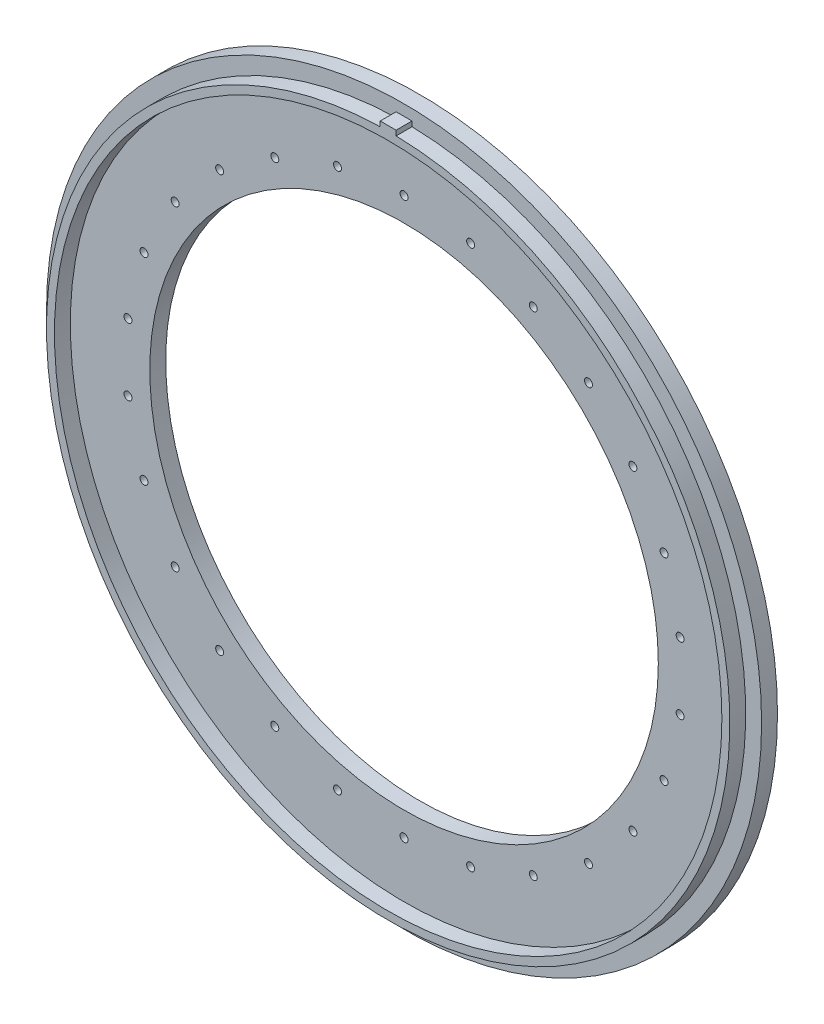
ISO-10303-21;
HEADER;
FILE_DESCRIPTION(('STEP AP214'),'2;1');
FILE_NAME('part.step','',(''),(''),'','','');
FILE_SCHEMA(('AUTOMOTIVE_DESIGN { 1 0 10303 214 1 1 1 1 }'));
ENDSEC;
DATA;
#1=APPLICATION_CONTEXT('core data for automotive mechanical design processes');
#2=APPLICATION_PROTOCOL_DEFINITION('international standard','automotive_design',2000,#1);
#3=PRODUCT_CONTEXT('',#1,'mechanical');
#4=PRODUCT('Part','Part','',(#3));
#5=PRODUCT_RELATED_PRODUCT_CATEGORY('part','',(#4));
#6=PRODUCT_DEFINITION_FORMATION('','',#4);
#7=PRODUCT_DEFINITION_CONTEXT('part definition',#1,'design');
#8=PRODUCT_DEFINITION('design','',#6,#7);
#9=PRODUCT_DEFINITION_SHAPE('','',#8);
#10=(LENGTH_UNIT() NAMED_UNIT(*) SI_UNIT(.MILLI.,.METRE.));
#11=(NAMED_UNIT(*) PLANE_ANGLE_UNIT() SI_UNIT($,.RADIAN.));
#12=(NAMED_UNIT(*) SI_UNIT($,.STERADIAN.) SOLID_ANGLE_UNIT());
#13=UNCERTAINTY_MEASURE_WITH_UNIT(LENGTH_MEASURE(1.E-05),#10,'distance_accuracy_value','');
#14=(GEOMETRIC_REPRESENTATION_CONTEXT(3) GLOBAL_UNCERTAINTY_ASSIGNED_CONTEXT((#13)) GLOBAL_UNIT_ASSIGNED_CONTEXT((#10,
#11,#12)) REPRESENTATION_CONTEXT('',''));
#15=CARTESIAN_POINT('',(0.,0.,0.));
#16=DIRECTION('',(0.,0.,1.));
#17=DIRECTION('',(1.,0.,0.));
#18=AXIS2_PLACEMENT_3D('',#15,#16,#17);
#19=CARTESIAN_POINT('',(0.,0.,2.));
#20=DIRECTION('',(0.,0.,1.));
#21=DIRECTION('',(1.,0.,0.));
#22=AXIS2_PLACEMENT_3D('',#19,#20,#21);
#23=PLANE('',#22);
#24=CARTESIAN_POINT('',(0.,0.,2.));
#25=DIRECTION('',(0.,0.,1.));
#26=DIRECTION('',(1.,0.,0.));
#27=AXIS2_PLACEMENT_3D('',#24,#25,#26);
#28=CIRCLE('',#27,45.);
#29=CARTESIAN_POINT('',(45.,0.,2.));
#30=VERTEX_POINT('',#29);
#31=EDGE_CURVE('E40',#30,#30,#28,.T.);
#32=ORIENTED_EDGE('',*,*,#31,.T.);
#33=EDGE_LOOP('',(#32));
#34=FACE_BOUND('',#33,.T.);
#35=DIRECTION('',(0.,1.,0.));
#36=VECTOR('',#35,1.);
#37=CARTESIAN_POINT('',(1.,43.6174993676133,2.));
#38=LINE('',#37,#36);
#39=CARTESIAN_POINT('',(1.,42.9883705204094,2.));
#40=VERTEX_POINT('',#39);
#41=CARTESIAN_POINT('',(1.,43.6174993676133,2.));
#42=VERTEX_POINT('',#41);
#43=EDGE_CURVE('E89',#40,#42,#38,.T.);
#44=ORIENTED_EDGE('',*,*,#43,.F.);
#45=CARTESIAN_POINT('',(0.,0.,2.));
#46=DIRECTION('',(0.,0.,1.));
#47=DIRECTION('',(1.,0.,0.));
#48=AXIS2_PLACEMENT_3D('',#45,#46,#47);
#49=CIRCLE('',#48,43.);
#50=CARTESIAN_POINT('',(-1.,42.9883705204094,2.));
#51=VERTEX_POINT('',#50);
#52=EDGE_CURVE('E100',#51,#40,#49,.T.);
#53=ORIENTED_EDGE('',*,*,#52,.F.);
#54=DIRECTION('',(0.,-1.,0.));
#55=VECTOR('',#54,1.);
#56=CARTESIAN_POINT('',(-1.,43.6174993676133,2.));
#57=LINE('',#56,#55);
#58=CARTESIAN_POINT('',(-1.,43.6174993676133,2.));
#59=VERTEX_POINT('',#58);
#60=EDGE_CURVE('E69',#59,#51,#57,.T.);
#61=ORIENTED_EDGE('',*,*,#60,.F.);
#62=DIRECTION('',(-1.,0.,0.));
#63=VECTOR('',#62,1.);
#64=CARTESIAN_POINT('',(-1.,43.6174993676133,2.));
#65=LINE('',#64,#63);
#66=EDGE_CURVE('E105',#42,#59,#65,.T.);
#67=ORIENTED_EDGE('',*,*,#66,.F.);
#68=EDGE_LOOP('',(#44,#53,#61,#67));
#69=FACE_BOUND('',#68,.T.);
#70=ADVANCED_FACE('F32',(#34,#69),#23,.T.);
#71=CARTESIAN_POINT('',(0.,0.,2.));
#72=DIRECTION('',(0.,0.,-1.));
#73=DIRECTION('',(-1.,0.,0.));
#74=AXIS2_PLACEMENT_3D('',#71,#72,#73);
#75=CYLINDRICAL_SURFACE('',#74,45.);
#76=ORIENTED_EDGE('',*,*,#31,.F.);
#77=EDGE_LOOP('',(#76));
#78=FACE_BOUND('',#77,.T.);
#79=CARTESIAN_POINT('',(0.,0.,0.));
#80=DIRECTION('',(0.,0.,1.));
#81=DIRECTION('',(1.,0.,0.));
#82=AXIS2_PLACEMENT_3D('',#79,#80,#81);
#83=CIRCLE('',#82,45.);
#84=CARTESIAN_POINT('',(45.,0.,0.));
#85=VERTEX_POINT('',#84);
#86=EDGE_CURVE('E111',#85,#85,#83,.T.);
#87=ORIENTED_EDGE('',*,*,#86,.T.);
#88=EDGE_LOOP('',(#87));
#89=FACE_BOUND('',#88,.T.);
#90=ADVANCED_FACE('F34',(#78,#89),#75,.T.);
#91=CARTESIAN_POINT('',(0.,0.,0.));
#92=DIRECTION('',(0.,0.,1.));
#93=DIRECTION('',(1.,0.,0.));
#94=AXIS2_PLACEMENT_3D('',#91,#92,#93);
#95=PLANE('',#94);
#96=CARTESIAN_POINT('',(-8.37604825006407,33.9829636099119,0.));
#97=DIRECTION('',(0.,0.,1.));
#98=DIRECTION('',(1.,0.,0.));
#99=AXIS2_PLACEMENT_3D('',#96,#97,#98);
#100=CIRCLE('',#99,0.499999999999998);
#101=CARTESIAN_POINT('',(-7.87604825006407,33.9829636099119,0.));
#102=VERTEX_POINT('',#101);
#103=EDGE_CURVE('E370',#102,#102,#100,.T.);
#104=ORIENTED_EDGE('',*,*,#103,.T.);
#105=EDGE_LOOP('',(#104));
#106=FACE_BOUND('',#105,.T.);
#107=CARTESIAN_POINT('',(-16.2653110215315,30.9909608978626,0.));
#108=DIRECTION('',(0.,0.,1.));
#109=DIRECTION('',(1.,0.,0.));
#110=AXIS2_PLACEMENT_3D('',#107,#108,#109);
#111=CIRCLE('',#110,0.499999999999998);
#112=CARTESIAN_POINT('',(-15.7653110215315,30.9909608978626,0.));
#113=VERTEX_POINT('',#112);
#114=EDGE_CURVE('E366',#113,#113,#111,.T.);
#115=ORIENTED_EDGE('',*,*,#114,.T.);
#116=EDGE_LOOP('',(#115));
#117=FACE_BOUND('',#116,.T.);
#118=CARTESIAN_POINT('',(-23.2092930384275,26.1978761859875,0.));
#119=DIRECTION('',(0.,0.,1.));
#120=DIRECTION('',(1.,0.,0.));
#121=AXIS2_PLACEMENT_3D('',#118,#119,#120);
#122=CIRCLE('',#121,0.500000000001064);
#123=CARTESIAN_POINT('',(-22.7092930384264,26.1978761859875,0.));
#124=VERTEX_POINT('',#123);
#125=EDGE_CURVE('E362',#124,#124,#122,.T.);
#126=ORIENTED_EDGE('',*,*,#125,.T.);
#127=EDGE_LOOP('',(#126));
#128=FACE_BOUND('',#127,.T.);
#129=CARTESIAN_POINT('',(-28.8044353062773,19.8822661355892,0.));
#130=DIRECTION('',(0.,0.,1.));
#131=DIRECTION('',(1.,0.,0.));
#132=AXIS2_PLACEMENT_3D('',#129,#130,#131);
#133=CIRCLE('',#132,0.500000000001384);
#134=CARTESIAN_POINT('',(-28.304435306276,19.8822661355892,0.));
#135=VERTEX_POINT('',#134);
#136=EDGE_CURVE('E358',#135,#135,#133,.T.);
#137=ORIENTED_EDGE('',*,*,#136,.T.);
#138=EDGE_LOOP('',(#137));
#139=FACE_BOUND('',#138,.T.);
#140=CARTESIAN_POINT('',(-32.7255684939886,12.4111710464874,0.));
#141=DIRECTION('',(0.,0.,1.));
#142=DIRECTION('',(1.,0.,0.));
#143=AXIS2_PLACEMENT_3D('',#140,#141,#142);
#144=CIRCLE('',#143,0.500000000001712);
#145=CARTESIAN_POINT('',(-32.2255684939868,12.4111710464874,0.));
#146=VERTEX_POINT('',#145);
#147=EDGE_CURVE('E354',#146,#146,#144,.T.);
#148=ORIENTED_EDGE('',*,*,#147,.T.);
#149=EDGE_LOOP('',(#148));
#150=FACE_BOUND('',#149,.T.);
#151=CARTESIAN_POINT('',(-34.7448105934306,4.21878380893481,0.));
#152=DIRECTION('',(0.,0.,1.));
#153=DIRECTION('',(1.,0.,0.));
#154=AXIS2_PLACEMENT_3D('',#151,#152,#153);
#155=CIRCLE('',#154,0.500000000002069);
#156=CARTESIAN_POINT('',(-34.2448105934285,4.21878380893481,0.));
#157=VERTEX_POINT('',#156);
#158=EDGE_CURVE('E350',#157,#157,#155,.T.);
#159=ORIENTED_EDGE('',*,*,#158,.T.);
#160=EDGE_LOOP('',(#159));
#161=FACE_BOUND('',#160,.T.);
#162=CARTESIAN_POINT('',(-34.7448105934302,-4.2187838089378,0.));
#163=DIRECTION('',(0.,0.,1.));
#164=DIRECTION('',(1.,0.,0.));
#165=AXIS2_PLACEMENT_3D('',#162,#163,#164);
#166=CIRCLE('',#165,0.500000000002381);
#167=CARTESIAN_POINT('',(-34.2448105934279,-4.2187838089378,0.));
#168=VERTEX_POINT('',#167);
#169=EDGE_CURVE('E346',#168,#168,#166,.T.);
#170=ORIENTED_EDGE('',*,*,#169,.T.);
#171=EDGE_LOOP('',(#170));
#172=FACE_BOUND('',#171,.T.);
#173=CARTESIAN_POINT('',(-32.7255684939875,-12.4111710464901,0.));
#174=DIRECTION('',(0.,0.,1.));
#175=DIRECTION('',(1.,0.,0.));
#176=AXIS2_PLACEMENT_3D('',#173,#174,#175);
#177=CIRCLE('',#176,0.500000000002655);
#178=CARTESIAN_POINT('',(-32.2255684939849,-12.4111710464901,0.));
#179=VERTEX_POINT('',#178);
#180=EDGE_CURVE('E342',#179,#179,#177,.T.);
#181=ORIENTED_EDGE('',*,*,#180,.T.);
#182=EDGE_LOOP('',(#181));
#183=FACE_BOUND('',#182,.T.);
#184=CARTESIAN_POINT('',(-28.8044353062756,-19.8822661355917,0.));
#185=DIRECTION('',(0.,0.,1.));
#186=DIRECTION('',(1.,0.,0.));
#187=AXIS2_PLACEMENT_3D('',#184,#185,#186);
#188=CIRCLE('',#187,0.500000000002874);
#189=CARTESIAN_POINT('',(-28.3044353062728,-19.8822661355917,0.));
#190=VERTEX_POINT('',#189);
#191=EDGE_CURVE('E338',#190,#190,#188,.T.);
#192=ORIENTED_EDGE('',*,*,#191,.T.);
#193=EDGE_LOOP('',(#192));
#194=FACE_BOUND('',#193,.T.);
#195=CARTESIAN_POINT('',(-23.2092930384252,-26.1978761859895,0.));
#196=DIRECTION('',(0.,0.,1.));
#197=DIRECTION('',(1.,0.,0.));
#198=AXIS2_PLACEMENT_3D('',#195,#196,#197);
#199=CIRCLE('',#198,0.500000000003067);
#200=CARTESIAN_POINT('',(-22.7092930384222,-26.1978761859895,0.));
#201=VERTEX_POINT('',#200);
#202=EDGE_CURVE('E334',#201,#201,#199,.T.);
#203=ORIENTED_EDGE('',*,*,#202,.T.);
#204=EDGE_LOOP('',(#203));
#205=FACE_BOUND('',#204,.T.);
#206=CARTESIAN_POINT('',(-16.2653110215291,-30.990960897863,0.));
#207=DIRECTION('',(0.,0.,1.));
#208=DIRECTION('',(1.,0.,0.));
#209=AXIS2_PLACEMENT_3D('',#206,#207,#208);
#210=CIRCLE('',#209,0.50000000000315);
#211=CARTESIAN_POINT('',(-15.7653110215259,-30.990960897863,0.));
#212=VERTEX_POINT('',#211);
#213=EDGE_CURVE('E330',#212,#212,#210,.T.);
#214=ORIENTED_EDGE('',*,*,#213,.T.);
#215=EDGE_LOOP('',(#214));
#216=FACE_BOUND('',#215,.T.);
#217=CARTESIAN_POINT('',(-8.37604825006158,-33.9829636099122,0.));
#218=DIRECTION('',(0.,0.,1.));
#219=DIRECTION('',(1.,0.,0.));
#220=AXIS2_PLACEMENT_3D('',#217,#218,#219);
#221=CIRCLE('',#220,0.500000000003176);
#222=CARTESIAN_POINT('',(-7.87604825005841,-33.9829636099122,0.));
#223=VERTEX_POINT('',#222);
#224=EDGE_CURVE('E326',#223,#223,#221,.T.);
#225=ORIENTED_EDGE('',*,*,#224,.T.);
#226=EDGE_LOOP('',(#225));
#227=FACE_BOUND('',#226,.T.);
#228=CARTESIAN_POINT('',(2.97570696259839E-12,-35.,0.));
#229=DIRECTION('',(0.,0.,1.));
#230=DIRECTION('',(1.,0.,0.));
#231=AXIS2_PLACEMENT_3D('',#228,#229,#230);
#232=CIRCLE('',#231,0.500000000003081);
#233=CARTESIAN_POINT('',(0.500000000006056,-35.,0.));
#234=VERTEX_POINT('',#233);
#235=EDGE_CURVE('E322',#234,#234,#232,.T.);
#236=ORIENTED_EDGE('',*,*,#235,.T.);
#237=EDGE_LOOP('',(#236));
#238=FACE_BOUND('',#237,.T.);
#239=CARTESIAN_POINT('',(8.37604825006746,-33.9829636099115,0.));
#240=DIRECTION('',(0.,0.,1.));
#241=DIRECTION('',(1.,0.,0.));
#242=AXIS2_PLACEMENT_3D('',#239,#240,#241);
#243=CIRCLE('',#242,0.500000000002926);
#244=CARTESIAN_POINT('',(8.87604825007039,-33.9829636099115,0.));
#245=VERTEX_POINT('',#244);
#246=EDGE_CURVE('E318',#245,#245,#243,.T.);
#247=ORIENTED_EDGE('',*,*,#246,.T.);
#248=EDGE_LOOP('',(#247));
#249=FACE_BOUND('',#248,.T.);
#250=CARTESIAN_POINT('',(16.2653110215347,-30.9909608978617,0.));
#251=DIRECTION('',(0.,0.,1.));
#252=DIRECTION('',(1.,0.,0.));
#253=AXIS2_PLACEMENT_3D('',#250,#251,#252);
#254=CIRCLE('',#253,0.50000000000269);
#255=CARTESIAN_POINT('',(16.7653110215374,-30.9909608978617,0.));
#256=VERTEX_POINT('',#255);
#257=EDGE_CURVE('E314',#256,#256,#254,.T.);
#258=ORIENTED_EDGE('',*,*,#257,.T.);
#259=EDGE_LOOP('',(#258));
#260=FACE_BOUND('',#259,.T.);
#261=CARTESIAN_POINT('',(23.2092930384304,-26.1978761859875,0.));
#262=DIRECTION('',(0.,0.,1.));
#263=DIRECTION('',(1.,0.,0.));
#264=AXIS2_PLACEMENT_3D('',#261,#262,#263);
#265=CIRCLE('',#264,0.500000000002395);
#266=CARTESIAN_POINT('',(23.7092930384328,-26.1978761859875,0.));
#267=VERTEX_POINT('',#266);
#268=EDGE_CURVE('E310',#267,#267,#265,.T.);
#269=ORIENTED_EDGE('',*,*,#268,.T.);
#270=EDGE_LOOP('',(#269));
#271=FACE_BOUND('',#270,.T.);
#272=CARTESIAN_POINT('',(28.8044353062803,-19.8822661355892,0.));
#273=DIRECTION('',(0.,0.,1.));
#274=DIRECTION('',(1.,0.,0.));
#275=AXIS2_PLACEMENT_3D('',#272,#273,#274);
#276=CIRCLE('',#275,0.500000000002028);
#277=CARTESIAN_POINT('',(29.3044353062823,-19.8822661355892,0.));
#278=VERTEX_POINT('',#277);
#279=EDGE_CURVE('E306',#278,#278,#276,.T.);
#280=ORIENTED_EDGE('',*,*,#279,.T.);
#281=EDGE_LOOP('',(#280));
#282=FACE_BOUND('',#281,.T.);
#283=CARTESIAN_POINT('',(32.7255684939915,-12.4111710464874,0.));
#284=DIRECTION('',(0.,0.,1.));
#285=DIRECTION('',(1.,0.,0.));
#286=AXIS2_PLACEMENT_3D('',#283,#284,#285);
#287=CIRCLE('',#286,0.500000000001667);
#288=CARTESIAN_POINT('',(33.2255684939932,-12.4111710464874,0.));
#289=VERTEX_POINT('',#288);
#290=EDGE_CURVE('E302',#289,#289,#287,.T.);
#291=ORIENTED_EDGE('',*,*,#290,.T.);
#292=EDGE_LOOP('',(#291));
#293=FACE_BOUND('',#292,.T.);
#294=CARTESIAN_POINT('',(34.7448105934336,-4.21878380893483,0.));
#295=DIRECTION('',(0.,0.,1.));
#296=DIRECTION('',(1.,0.,0.));
#297=AXIS2_PLACEMENT_3D('',#294,#295,#296);
#298=CIRCLE('',#297,0.50000000000129);
#299=CARTESIAN_POINT('',(35.2448105934348,-4.21878380893483,0.));
#300=VERTEX_POINT('',#299);
#301=EDGE_CURVE('E298',#300,#300,#298,.T.);
#302=ORIENTED_EDGE('',*,*,#301,.T.);
#303=EDGE_LOOP('',(#302));
#304=FACE_BOUND('',#303,.T.);
#305=CARTESIAN_POINT('',(34.7448105934332,4.21878380893779,0.));
#306=DIRECTION('',(0.,0.,1.));
#307=DIRECTION('',(1.,0.,0.));
#308=AXIS2_PLACEMENT_3D('',#305,#306,#307);
#309=CIRCLE('',#308,0.500000000000935);
#310=CARTESIAN_POINT('',(35.2448105934341,4.21878380893779,0.));
#311=VERTEX_POINT('',#310);
#312=EDGE_CURVE('E294',#311,#311,#309,.T.);
#313=ORIENTED_EDGE('',*,*,#312,.T.);
#314=EDGE_LOOP('',(#313));
#315=FACE_BOUND('',#314,.T.);
#316=CARTESIAN_POINT('',(32.7255684939905,12.4111710464901,0.));
#317=DIRECTION('',(0.,0.,1.));
#318=DIRECTION('',(1.,0.,0.));
#319=AXIS2_PLACEMENT_3D('',#316,#317,#318);
#320=CIRCLE('',#319,0.500000000000611);
#321=CARTESIAN_POINT('',(33.2255684939911,12.4111710464901,0.));
#322=VERTEX_POINT('',#321);
#323=EDGE_CURVE('E290',#322,#322,#320,.T.);
#324=ORIENTED_EDGE('',*,*,#323,.T.);
#325=EDGE_LOOP('',(#324));
#326=FACE_BOUND('',#325,.T.);
#327=CARTESIAN_POINT('',(28.8044353062786,19.8822661355917,0.));
#328=DIRECTION('',(0.,0.,1.));
#329=DIRECTION('',(1.,0.,0.));
#330=AXIS2_PLACEMENT_3D('',#327,#328,#329);
#331=CIRCLE('',#330,0.50000000000033);
#332=CARTESIAN_POINT('',(29.3044353062789,19.8822661355917,0.));
#333=VERTEX_POINT('',#332);
#334=EDGE_CURVE('E286',#333,#333,#331,.T.);
#335=ORIENTED_EDGE('',*,*,#334,.T.);
#336=EDGE_LOOP('',(#335));
#337=FACE_BOUND('',#336,.T.);
#338=CARTESIAN_POINT('',(23.2092930384282,26.1978761859895,0.));
#339=DIRECTION('',(0.,0.,1.));
#340=DIRECTION('',(1.,0.,0.));
#341=AXIS2_PLACEMENT_3D('',#338,#339,#340);
#342=CIRCLE('',#341,0.500000000000129);
#343=CARTESIAN_POINT('',(23.7092930384283,26.1978761859895,0.));
#344=VERTEX_POINT('',#343);
#345=EDGE_CURVE('E282',#344,#344,#342,.T.);
#346=ORIENTED_EDGE('',*,*,#345,.T.);
#347=EDGE_LOOP('',(#346));
#348=FACE_BOUND('',#347,.T.);
#349=CARTESIAN_POINT('',(16.2653110215319,30.9909608978623,0.));
#350=DIRECTION('',(0.,0.,1.));
#351=DIRECTION('',(1.,0.,0.));
#352=AXIS2_PLACEMENT_3D('',#349,#350,#351);
#353=CIRCLE('',#352,0.500000000000002);
#354=CARTESIAN_POINT('',(16.7653110215319,30.9909608978623,0.));
#355=VERTEX_POINT('',#354);
#356=EDGE_CURVE('E278',#355,#355,#353,.T.);
#357=ORIENTED_EDGE('',*,*,#356,.T.);
#358=EDGE_LOOP('',(#357));
#359=FACE_BOUND('',#358,.T.);
#360=CARTESIAN_POINT('',(8.37604825006454,33.9829636099118,0.));
#361=DIRECTION('',(0.,0.,1.));
#362=DIRECTION('',(1.,0.,0.));
#363=AXIS2_PLACEMENT_3D('',#360,#361,#362);
#364=CIRCLE('',#363,0.500000000000001);
#365=CARTESIAN_POINT('',(8.87604825006454,33.9829636099118,0.));
#366=VERTEX_POINT('',#365);
#367=EDGE_CURVE('E275',#366,#366,#364,.T.);
#368=ORIENTED_EDGE('',*,*,#367,.T.);
#369=EDGE_LOOP('',(#368));
#370=FACE_BOUND('',#369,.T.);
#371=CARTESIAN_POINT('',(0.,0.,0.));
#372=DIRECTION('',(0.,0.,1.));
#373=DIRECTION('',(1.,0.,0.));
#374=AXIS2_PLACEMENT_3D('',#371,#372,#373);
#375=CIRCLE('',#374,32.);
#376=CARTESIAN_POINT('',(32.,0.,0.));
#377=VERTEX_POINT('',#376);
#378=EDGE_CURVE('E265',#377,#377,#375,.T.);
#379=ORIENTED_EDGE('',*,*,#378,.T.);
#380=EDGE_LOOP('',(#379));
#381=FACE_BOUND('',#380,.T.);
#382=CARTESIAN_POINT('',(0.,35.,0.));
#383=DIRECTION('',(0.,0.,1.));
#384=DIRECTION('',(1.,0.,0.));
#385=AXIS2_PLACEMENT_3D('',#382,#383,#384);
#386=CIRCLE('',#385,0.5);
#387=CARTESIAN_POINT('',(0.5,35.,0.));
#388=VERTEX_POINT('',#387);
#389=EDGE_CURVE('E264',#388,#388,#386,.T.);
#390=ORIENTED_EDGE('',*,*,#389,.T.);
#391=EDGE_LOOP('',(#390));
#392=FACE_BOUND('',#391,.T.);
#393=ORIENTED_EDGE('',*,*,#86,.F.);
#394=EDGE_LOOP('',(#393));
#395=FACE_BOUND('',#394,.T.);
#396=ADVANCED_FACE('F117',(#106,#117,#128,#139,#150,#161,#172,#183,#194,#205,#216,#227,#238,
#249,#260,#271,#282,#293,#304,#315,#326,#337,#348,#359,#370,#381,#392,#395),#95,.F.);
#397=CARTESIAN_POINT('',(0.,0.,4.));
#398=DIRECTION('',(0.,0.,1.));
#399=DIRECTION('',(1.,0.,0.));
#400=AXIS2_PLACEMENT_3D('',#397,#398,#399);
#401=PLANE('',#400);
#402=CARTESIAN_POINT('',(0.,0.,4.));
#403=DIRECTION('',(0.,0.,1.));
#404=DIRECTION('',(1.,0.,0.));
#405=AXIS2_PLACEMENT_3D('',#402,#403,#404);
#406=CIRCLE('',#405,43.);
#407=CARTESIAN_POINT('',(-1.,42.9883705204094,4.));
#408=VERTEX_POINT('',#407);
#409=CARTESIAN_POINT('',(1.,42.9883705204094,4.));
#410=VERTEX_POINT('',#409);
#411=EDGE_CURVE('E82',#408,#410,#406,.T.);
#412=ORIENTED_EDGE('',*,*,#411,.T.);
#413=DIRECTION('',(0.,1.,0.));
#414=VECTOR('',#413,1.);
#415=CARTESIAN_POINT('',(1.,43.6174993676133,4.));
#416=LINE('',#415,#414);
#417=CARTESIAN_POINT('',(1.,43.6174993676133,4.));
#418=VERTEX_POINT('',#417);
#419=EDGE_CURVE('E76',#410,#418,#416,.T.);
#420=ORIENTED_EDGE('',*,*,#419,.T.);
#421=DIRECTION('',(-1.,0.,0.));
#422=VECTOR('',#421,1.);
#423=CARTESIAN_POINT('',(-1.,43.6174993676133,4.));
#424=LINE('',#423,#422);
#425=CARTESIAN_POINT('',(-1.,43.6174993676133,4.));
#426=VERTEX_POINT('',#425);
#427=EDGE_CURVE('E80',#418,#426,#424,.T.);
#428=ORIENTED_EDGE('',*,*,#427,.T.);
#429=DIRECTION('',(0.,-1.,0.));
#430=VECTOR('',#429,1.);
#431=CARTESIAN_POINT('',(-1.,43.6174993676133,4.));
#432=LINE('',#431,#430);
#433=EDGE_CURVE('E55',#426,#408,#432,.T.);
#434=ORIENTED_EDGE('',*,*,#433,.T.);
#435=EDGE_LOOP('',(#412,#420,#428,#434));
#436=FACE_BOUND('',#435,.T.);
#437=CARTESIAN_POINT('',(0.,0.,4.));
#438=DIRECTION('',(0.,0.,1.));
#439=DIRECTION('',(1.,0.,0.));
#440=AXIS2_PLACEMENT_3D('',#437,#438,#439);
#441=CIRCLE('',#440,42.);
#442=CARTESIAN_POINT('',(42.,0.,4.));
#443=VERTEX_POINT('',#442);
#444=EDGE_CURVE('E103',#443,#443,#441,.T.);
#445=ORIENTED_EDGE('',*,*,#444,.F.);
#446=EDGE_LOOP('',(#445));
#447=FACE_BOUND('',#446,.T.);
#448=ADVANCED_FACE('F77',(#436,#447),#401,.T.);
#449=CARTESIAN_POINT('',(0.,0.,4.));
#450=DIRECTION('',(0.,0.,-1.));
#451=DIRECTION('',(-1.,0.,0.));
#452=AXIS2_PLACEMENT_3D('',#449,#450,#451);
#453=CYLINDRICAL_SURFACE('',#452,43.);
#454=ORIENTED_EDGE('',*,*,#52,.T.);
#455=DIRECTION('',(0.,0.,-1.));
#456=VECTOR('',#455,1.);
#457=CARTESIAN_POINT('',(1.,42.9883705204094,4.));
#458=LINE('',#457,#456);
#459=EDGE_CURVE('E92',#410,#40,#458,.T.);
#460=ORIENTED_EDGE('',*,*,#459,.F.);
#461=ORIENTED_EDGE('',*,*,#411,.F.);
#462=DIRECTION('',(0.,0.,-1.));
#463=VECTOR('',#462,1.);
#464=CARTESIAN_POINT('',(-1.,42.9883705204094,4.));
#465=LINE('',#464,#463);
#466=EDGE_CURVE('E96',#408,#51,#465,.T.);
#467=ORIENTED_EDGE('',*,*,#466,.T.);
#468=EDGE_LOOP('',(#454,#460,#461,#467));
#469=FACE_BOUND('',#468,.T.);
#470=ADVANCED_FACE('F125',(#469),#453,.T.);
#471=CARTESIAN_POINT('',(1.,43.6174993676133,4.));
#472=DIRECTION('',(-1.,0.,0.));
#473=DIRECTION('',(0.,-1.,0.));
#474=AXIS2_PLACEMENT_3D('',#471,#472,#473);
#475=PLANE('',#474);
#476=ORIENTED_EDGE('',*,*,#43,.T.);
#477=DIRECTION('',(0.,0.,-1.));
#478=VECTOR('',#477,1.);
#479=CARTESIAN_POINT('',(1.,43.6174993676133,4.));
#480=LINE('',#479,#478);
#481=EDGE_CURVE('E86',#418,#42,#480,.T.);
#482=ORIENTED_EDGE('',*,*,#481,.F.);
#483=ORIENTED_EDGE('',*,*,#419,.F.);
#484=ORIENTED_EDGE('',*,*,#459,.T.);
#485=EDGE_LOOP('',(#476,#482,#483,#484));
#486=FACE_BOUND('',#485,.T.);
#487=ADVANCED_FACE('F87',(#486),#475,.F.);
#488=CARTESIAN_POINT('',(-1.,43.6174993676133,4.));
#489=DIRECTION('',(0.,-1.,0.));
#490=DIRECTION('',(0.,0.,-1.));
#491=AXIS2_PLACEMENT_3D('',#488,#489,#490);
#492=PLANE('',#491);
#493=ORIENTED_EDGE('',*,*,#66,.T.);
#494=DIRECTION('',(0.,0.,-1.));
#495=VECTOR('',#494,1.);
#496=CARTESIAN_POINT('',(-1.,43.6174993676133,4.));
#497=LINE('',#496,#495);
#498=EDGE_CURVE('E47',#426,#59,#497,.T.);
#499=ORIENTED_EDGE('',*,*,#498,.F.);
#500=ORIENTED_EDGE('',*,*,#427,.F.);
#501=ORIENTED_EDGE('',*,*,#481,.T.);
#502=EDGE_LOOP('',(#493,#499,#500,#501));
#503=FACE_BOUND('',#502,.T.);
#504=ADVANCED_FACE('F94',(#503),#492,.F.);
#505=CARTESIAN_POINT('',(-1.,43.6174993676133,4.));
#506=DIRECTION('',(1.,0.,0.));
#507=DIRECTION('',(0.,1.,0.));
#508=AXIS2_PLACEMENT_3D('',#505,#506,#507);
#509=PLANE('',#508);
#510=ORIENTED_EDGE('',*,*,#60,.T.);
#511=ORIENTED_EDGE('',*,*,#466,.F.);
#512=ORIENTED_EDGE('',*,*,#433,.F.);
#513=ORIENTED_EDGE('',*,*,#498,.T.);
#514=EDGE_LOOP('',(#510,#511,#512,#513));
#515=FACE_BOUND('',#514,.T.);
#516=ADVANCED_FACE('F150',(#515),#509,.F.);
#517=CARTESIAN_POINT('',(0.,0.,4.));
#518=DIRECTION('',(0.,0.,-1.));
#519=DIRECTION('',(-1.,0.,0.));
#520=AXIS2_PLACEMENT_3D('',#517,#518,#519);
#521=CYLINDRICAL_SURFACE('',#520,42.);
#522=ORIENTED_EDGE('',*,*,#444,.T.);
#523=EDGE_LOOP('',(#522));
#524=FACE_BOUND('',#523,.T.);
#525=CARTESIAN_POINT('',(0.,0.,2.));
#526=DIRECTION('',(0.,0.,1.));
#527=DIRECTION('',(1.,0.,0.));
#528=AXIS2_PLACEMENT_3D('',#525,#526,#527);
#529=CIRCLE('',#528,42.);
#530=CARTESIAN_POINT('',(42.,0.,2.));
#531=VERTEX_POINT('',#530);
#532=EDGE_CURVE('E11',#531,#531,#529,.F.);
#533=ORIENTED_EDGE('',*,*,#532,.T.);
#534=EDGE_LOOP('',(#533));
#535=FACE_BOUND('',#534,.T.);
#536=ADVANCED_FACE('F140',(#524,#535),#521,.F.);
#537=CARTESIAN_POINT('',(-8.37604825006407,33.9829636099119,2.));
#538=DIRECTION('',(0.,0.,1.));
#539=DIRECTION('',(1.,0.,0.));
#540=AXIS2_PLACEMENT_3D('',#537,#538,#539);
#541=CIRCLE('',#540,0.499999999999998);
#542=CARTESIAN_POINT('',(-7.87604825006407,33.9829636099119,2.));
#543=VERTEX_POINT('',#542);
#544=EDGE_CURVE('E156',#543,#543,#541,.T.);
#545=ORIENTED_EDGE('',*,*,#544,.F.);
#546=EDGE_LOOP('',(#545));
#547=FACE_BOUND('',#546,.T.);
#548=CARTESIAN_POINT('',(-16.2653110215315,30.9909608978626,2.));
#549=DIRECTION('',(0.,0.,1.));
#550=DIRECTION('',(1.,0.,0.));
#551=AXIS2_PLACEMENT_3D('',#548,#549,#550);
#552=CIRCLE('',#551,0.499999999999998);
#553=CARTESIAN_POINT('',(-15.7653110215315,30.9909608978626,2.));
#554=VERTEX_POINT('',#553);
#555=EDGE_CURVE('E160',#554,#554,#552,.T.);
#556=ORIENTED_EDGE('',*,*,#555,.F.);
#557=EDGE_LOOP('',(#556));
#558=FACE_BOUND('',#557,.T.);
#559=CARTESIAN_POINT('',(-23.2092930384275,26.1978761859875,2.));
#560=DIRECTION('',(0.,0.,1.));
#561=DIRECTION('',(1.,0.,0.));
#562=AXIS2_PLACEMENT_3D('',#559,#560,#561);
#563=CIRCLE('',#562,0.500000000001064);
#564=CARTESIAN_POINT('',(-22.7092930384264,26.1978761859875,2.));
#565=VERTEX_POINT('',#564);
#566=EDGE_CURVE('E164',#565,#565,#563,.T.);
#567=ORIENTED_EDGE('',*,*,#566,.F.);
#568=EDGE_LOOP('',(#567));
#569=FACE_BOUND('',#568,.T.);
#570=CARTESIAN_POINT('',(-28.8044353062773,19.8822661355892,2.));
#571=DIRECTION('',(0.,0.,1.));
#572=DIRECTION('',(1.,0.,0.));
#573=AXIS2_PLACEMENT_3D('',#570,#571,#572);
#574=CIRCLE('',#573,0.500000000001384);
#575=CARTESIAN_POINT('',(-28.304435306276,19.8822661355892,2.));
#576=VERTEX_POINT('',#575);
#577=EDGE_CURVE('E168',#576,#576,#574,.T.);
#578=ORIENTED_EDGE('',*,*,#577,.F.);
#579=EDGE_LOOP('',(#578));
#580=FACE_BOUND('',#579,.T.);
#581=CARTESIAN_POINT('',(-32.7255684939886,12.4111710464874,2.));
#582=DIRECTION('',(0.,0.,1.));
#583=DIRECTION('',(1.,0.,0.));
#584=AXIS2_PLACEMENT_3D('',#581,#582,#583);
#585=CIRCLE('',#584,0.500000000001712);
#586=CARTESIAN_POINT('',(-32.2255684939868,12.4111710464874,2.));
#587=VERTEX_POINT('',#586);
#588=EDGE_CURVE('E172',#587,#587,#585,.T.);
#589=ORIENTED_EDGE('',*,*,#588,.F.);
#590=EDGE_LOOP('',(#589));
#591=FACE_BOUND('',#590,.T.);
#592=CARTESIAN_POINT('',(-34.7448105934306,4.21878380893481,2.));
#593=DIRECTION('',(0.,0.,1.));
#594=DIRECTION('',(1.,0.,0.));
#595=AXIS2_PLACEMENT_3D('',#592,#593,#594);
#596=CIRCLE('',#595,0.500000000002069);
#597=CARTESIAN_POINT('',(-34.2448105934285,4.21878380893481,2.));
#598=VERTEX_POINT('',#597);
#599=EDGE_CURVE('E176',#598,#598,#596,.T.);
#600=ORIENTED_EDGE('',*,*,#599,.F.);
#601=EDGE_LOOP('',(#600));
#602=FACE_BOUND('',#601,.T.);
#603=CARTESIAN_POINT('',(-34.7448105934302,-4.2187838089378,2.));
#604=DIRECTION('',(0.,0.,1.));
#605=DIRECTION('',(1.,0.,0.));
#606=AXIS2_PLACEMENT_3D('',#603,#604,#605);
#607=CIRCLE('',#606,0.500000000002381);
#608=CARTESIAN_POINT('',(-34.2448105934279,-4.2187838089378,2.));
#609=VERTEX_POINT('',#608);
#610=EDGE_CURVE('E180',#609,#609,#607,.T.);
#611=ORIENTED_EDGE('',*,*,#610,.F.);
#612=EDGE_LOOP('',(#611));
#613=FACE_BOUND('',#612,.T.);
#614=CARTESIAN_POINT('',(-32.7255684939875,-12.4111710464901,2.));
#615=DIRECTION('',(0.,0.,1.));
#616=DIRECTION('',(1.,0.,0.));
#617=AXIS2_PLACEMENT_3D('',#614,#615,#616);
#618=CIRCLE('',#617,0.500000000002655);
#619=CARTESIAN_POINT('',(-32.2255684939849,-12.4111710464901,2.));
#620=VERTEX_POINT('',#619);
#621=EDGE_CURVE('E184',#620,#620,#618,.T.);
#622=ORIENTED_EDGE('',*,*,#621,.F.);
#623=EDGE_LOOP('',(#622));
#624=FACE_BOUND('',#623,.T.);
#625=CARTESIAN_POINT('',(-28.8044353062756,-19.8822661355917,2.));
#626=DIRECTION('',(0.,0.,1.));
#627=DIRECTION('',(1.,0.,0.));
#628=AXIS2_PLACEMENT_3D('',#625,#626,#627);
#629=CIRCLE('',#628,0.500000000002874);
#630=CARTESIAN_POINT('',(-28.3044353062728,-19.8822661355917,2.));
#631=VERTEX_POINT('',#630);
#632=EDGE_CURVE('E188',#631,#631,#629,.T.);
#633=ORIENTED_EDGE('',*,*,#632,.F.);
#634=EDGE_LOOP('',(#633));
#635=FACE_BOUND('',#634,.T.);
#636=CARTESIAN_POINT('',(-23.2092930384252,-26.1978761859895,2.));
#637=DIRECTION('',(0.,0.,1.));
#638=DIRECTION('',(1.,0.,0.));
#639=AXIS2_PLACEMENT_3D('',#636,#637,#638);
#640=CIRCLE('',#639,0.500000000003067);
#641=CARTESIAN_POINT('',(-22.7092930384222,-26.1978761859895,2.));
#642=VERTEX_POINT('',#641);
#643=EDGE_CURVE('E192',#642,#642,#640,.T.);
#644=ORIENTED_EDGE('',*,*,#643,.F.);
#645=EDGE_LOOP('',(#644));
#646=FACE_BOUND('',#645,.T.);
#647=CARTESIAN_POINT('',(-16.2653110215291,-30.990960897863,2.));
#648=DIRECTION('',(0.,0.,1.));
#649=DIRECTION('',(1.,0.,0.));
#650=AXIS2_PLACEMENT_3D('',#647,#648,#649);
#651=CIRCLE('',#650,0.50000000000315);
#652=CARTESIAN_POINT('',(-15.7653110215259,-30.990960897863,2.));
#653=VERTEX_POINT('',#652);
#654=EDGE_CURVE('E196',#653,#653,#651,.T.);
#655=ORIENTED_EDGE('',*,*,#654,.F.);
#656=EDGE_LOOP('',(#655));
#657=FACE_BOUND('',#656,.T.);
#658=CARTESIAN_POINT('',(-8.37604825006158,-33.9829636099122,2.));
#659=DIRECTION('',(0.,0.,1.));
#660=DIRECTION('',(1.,0.,0.));
#661=AXIS2_PLACEMENT_3D('',#658,#659,#660);
#662=CIRCLE('',#661,0.500000000003176);
#663=CARTESIAN_POINT('',(-7.87604825005841,-33.9829636099122,2.));
#664=VERTEX_POINT('',#663);
#665=EDGE_CURVE('E200',#664,#664,#662,.T.);
#666=ORIENTED_EDGE('',*,*,#665,.F.);
#667=EDGE_LOOP('',(#666));
#668=FACE_BOUND('',#667,.T.);
#669=CARTESIAN_POINT('',(2.97570696259839E-12,-35.,2.));
#670=DIRECTION('',(0.,0.,1.));
#671=DIRECTION('',(1.,0.,0.));
#672=AXIS2_PLACEMENT_3D('',#669,#670,#671);
#673=CIRCLE('',#672,0.500000000003081);
#674=CARTESIAN_POINT('',(0.500000000006056,-35.,2.));
#675=VERTEX_POINT('',#674);
#676=EDGE_CURVE('E204',#675,#675,#673,.T.);
#677=ORIENTED_EDGE('',*,*,#676,.F.);
#678=EDGE_LOOP('',(#677));
#679=FACE_BOUND('',#678,.T.);
#680=CARTESIAN_POINT('',(8.37604825006746,-33.9829636099115,2.));
#681=DIRECTION('',(0.,0.,1.));
#682=DIRECTION('',(1.,0.,0.));
#683=AXIS2_PLACEMENT_3D('',#680,#681,#682);
#684=CIRCLE('',#683,0.500000000002926);
#685=CARTESIAN_POINT('',(8.87604825007039,-33.9829636099115,2.));
#686=VERTEX_POINT('',#685);
#687=EDGE_CURVE('E208',#686,#686,#684,.T.);
#688=ORIENTED_EDGE('',*,*,#687,.F.);
#689=EDGE_LOOP('',(#688));
#690=FACE_BOUND('',#689,.T.);
#691=CARTESIAN_POINT('',(16.2653110215347,-30.9909608978617,2.));
#692=DIRECTION('',(0.,0.,1.));
#693=DIRECTION('',(1.,0.,0.));
#694=AXIS2_PLACEMENT_3D('',#691,#692,#693);
#695=CIRCLE('',#694,0.50000000000269);
#696=CARTESIAN_POINT('',(16.7653110215374,-30.9909608978617,2.));
#697=VERTEX_POINT('',#696);
#698=EDGE_CURVE('E212',#697,#697,#695,.T.);
#699=ORIENTED_EDGE('',*,*,#698,.F.);
#700=EDGE_LOOP('',(#699));
#701=FACE_BOUND('',#700,.T.);
#702=CARTESIAN_POINT('',(23.2092930384304,-26.1978761859875,2.));
#703=DIRECTION('',(0.,0.,1.));
#704=DIRECTION('',(1.,0.,0.));
#705=AXIS2_PLACEMENT_3D('',#702,#703,#704);
#706=CIRCLE('',#705,0.500000000002395);
#707=CARTESIAN_POINT('',(23.7092930384328,-26.1978761859875,2.));
#708=VERTEX_POINT('',#707);
#709=EDGE_CURVE('E216',#708,#708,#706,.T.);
#710=ORIENTED_EDGE('',*,*,#709,.F.);
#711=EDGE_LOOP('',(#710));
#712=FACE_BOUND('',#711,.T.);
#713=CARTESIAN_POINT('',(28.8044353062803,-19.8822661355892,2.));
#714=DIRECTION('',(0.,0.,1.));
#715=DIRECTION('',(1.,0.,0.));
#716=AXIS2_PLACEMENT_3D('',#713,#714,#715);
#717=CIRCLE('',#716,0.500000000002028);
#718=CARTESIAN_POINT('',(29.3044353062823,-19.8822661355892,2.));
#719=VERTEX_POINT('',#718);
#720=EDGE_CURVE('E220',#719,#719,#717,.T.);
#721=ORIENTED_EDGE('',*,*,#720,.F.);
#722=EDGE_LOOP('',(#721));
#723=FACE_BOUND('',#722,.T.);
#724=CARTESIAN_POINT('',(32.7255684939915,-12.4111710464874,2.));
#725=DIRECTION('',(0.,0.,1.));
#726=DIRECTION('',(1.,0.,0.));
#727=AXIS2_PLACEMENT_3D('',#724,#725,#726);
#728=CIRCLE('',#727,0.500000000001667);
#729=CARTESIAN_POINT('',(33.2255684939932,-12.4111710464874,2.));
#730=VERTEX_POINT('',#729);
#731=EDGE_CURVE('E224',#730,#730,#728,.T.);
#732=ORIENTED_EDGE('',*,*,#731,.F.);
#733=EDGE_LOOP('',(#732));
#734=FACE_BOUND('',#733,.T.);
#735=CARTESIAN_POINT('',(34.7448105934336,-4.21878380893483,2.));
#736=DIRECTION('',(0.,0.,1.));
#737=DIRECTION('',(1.,0.,0.));
#738=AXIS2_PLACEMENT_3D('',#735,#736,#737);
#739=CIRCLE('',#738,0.50000000000129);
#740=CARTESIAN_POINT('',(35.2448105934348,-4.21878380893483,2.));
#741=VERTEX_POINT('',#740);
#742=EDGE_CURVE('E228',#741,#741,#739,.T.);
#743=ORIENTED_EDGE('',*,*,#742,.F.);
#744=EDGE_LOOP('',(#743));
#745=FACE_BOUND('',#744,.T.);
#746=CARTESIAN_POINT('',(34.7448105934332,4.21878380893779,2.));
#747=DIRECTION('',(0.,0.,1.));
#748=DIRECTION('',(1.,0.,0.));
#749=AXIS2_PLACEMENT_3D('',#746,#747,#748);
#750=CIRCLE('',#749,0.500000000000935);
#751=CARTESIAN_POINT('',(35.2448105934341,4.21878380893779,2.));
#752=VERTEX_POINT('',#751);
#753=EDGE_CURVE('E232',#752,#752,#750,.T.);
#754=ORIENTED_EDGE('',*,*,#753,.F.);
#755=EDGE_LOOP('',(#754));
#756=FACE_BOUND('',#755,.T.);
#757=CARTESIAN_POINT('',(32.7255684939905,12.4111710464901,2.));
#758=DIRECTION('',(0.,0.,1.));
#759=DIRECTION('',(1.,0.,0.));
#760=AXIS2_PLACEMENT_3D('',#757,#758,#759);
#761=CIRCLE('',#760,0.500000000000611);
#762=CARTESIAN_POINT('',(33.2255684939911,12.4111710464901,2.));
#763=VERTEX_POINT('',#762);
#764=EDGE_CURVE('E236',#763,#763,#761,.T.);
#765=ORIENTED_EDGE('',*,*,#764,.F.);
#766=EDGE_LOOP('',(#765));
#767=FACE_BOUND('',#766,.T.);
#768=CARTESIAN_POINT('',(28.8044353062786,19.8822661355917,2.));
#769=DIRECTION('',(0.,0.,1.));
#770=DIRECTION('',(1.,0.,0.));
#771=AXIS2_PLACEMENT_3D('',#768,#769,#770);
#772=CIRCLE('',#771,0.50000000000033);
#773=CARTESIAN_POINT('',(29.3044353062789,19.8822661355917,2.));
#774=VERTEX_POINT('',#773);
#775=EDGE_CURVE('E240',#774,#774,#772,.T.);
#776=ORIENTED_EDGE('',*,*,#775,.F.);
#777=EDGE_LOOP('',(#776));
#778=FACE_BOUND('',#777,.T.);
#779=CARTESIAN_POINT('',(23.2092930384282,26.1978761859895,2.));
#780=DIRECTION('',(0.,0.,1.));
#781=DIRECTION('',(1.,0.,0.));
#782=AXIS2_PLACEMENT_3D('',#779,#780,#781);
#783=CIRCLE('',#782,0.500000000000129);
#784=CARTESIAN_POINT('',(23.7092930384283,26.1978761859895,2.));
#785=VERTEX_POINT('',#784);
#786=EDGE_CURVE('E244',#785,#785,#783,.T.);
#787=ORIENTED_EDGE('',*,*,#786,.F.);
#788=EDGE_LOOP('',(#787));
#789=FACE_BOUND('',#788,.T.);
#790=CARTESIAN_POINT('',(16.2653110215319,30.9909608978623,2.));
#791=DIRECTION('',(0.,0.,1.));
#792=DIRECTION('',(1.,0.,0.));
#793=AXIS2_PLACEMENT_3D('',#790,#791,#792);
#794=CIRCLE('',#793,0.500000000000002);
#795=CARTESIAN_POINT('',(16.7653110215319,30.9909608978623,2.));
#796=VERTEX_POINT('',#795);
#797=EDGE_CURVE('E248',#796,#796,#794,.T.);
#798=ORIENTED_EDGE('',*,*,#797,.F.);
#799=EDGE_LOOP('',(#798));
#800=FACE_BOUND('',#799,.T.);
#801=CARTESIAN_POINT('',(8.37604825006454,33.9829636099118,2.));
#802=DIRECTION('',(0.,0.,1.));
#803=DIRECTION('',(1.,0.,0.));
#804=AXIS2_PLACEMENT_3D('',#801,#802,#803);
#805=CIRCLE('',#804,0.500000000000001);
#806=CARTESIAN_POINT('',(8.87604825006454,33.9829636099118,2.));
#807=VERTEX_POINT('',#806);
#808=EDGE_CURVE('E252',#807,#807,#805,.T.);
#809=ORIENTED_EDGE('',*,*,#808,.F.);
#810=EDGE_LOOP('',(#809));
#811=FACE_BOUND('',#810,.T.);
#812=CARTESIAN_POINT('',(0.,0.,2.));
#813=DIRECTION('',(0.,0.,1.));
#814=DIRECTION('',(1.,0.,0.));
#815=AXIS2_PLACEMENT_3D('',#812,#813,#814);
#816=CIRCLE('',#815,32.);
#817=CARTESIAN_POINT('',(32.,0.,2.));
#818=VERTEX_POINT('',#817);
#819=EDGE_CURVE('E256',#818,#818,#816,.T.);
#820=ORIENTED_EDGE('',*,*,#819,.F.);
#821=EDGE_LOOP('',(#820));
#822=FACE_BOUND('',#821,.T.);
#823=CARTESIAN_POINT('',(0.,35.,2.));
#824=DIRECTION('',(0.,0.,1.));
#825=DIRECTION('',(1.,0.,0.));
#826=AXIS2_PLACEMENT_3D('',#823,#824,#825);
#827=CIRCLE('',#826,0.5);
#828=CARTESIAN_POINT('',(0.5,35.,2.));
#829=VERTEX_POINT('',#828);
#830=EDGE_CURVE('E260',#829,#829,#827,.T.);
#831=ORIENTED_EDGE('',*,*,#830,.F.);
#832=EDGE_LOOP('',(#831));
#833=FACE_BOUND('',#832,.T.);
#834=ORIENTED_EDGE('',*,*,#532,.F.);
#835=EDGE_LOOP('',(#834));
#836=FACE_BOUND('',#835,.T.);
#837=ADVANCED_FACE('F134',(#547,#558,#569,#580,#591,#602,#613,#624,#635,#646,#657,#668,#679,
#690,#701,#712,#723,#734,#745,#756,#767,#778,#789,#800,#811,#822,#833,#836),#23,.T.);
#838=CARTESIAN_POINT('',(0.,35.,0.));
#839=DIRECTION('',(0.,0.,1.));
#840=DIRECTION('',(1.,0.,0.));
#841=AXIS2_PLACEMENT_3D('',#838,#839,#840);
#842=CYLINDRICAL_SURFACE('',#841,0.5);
#843=ORIENTED_EDGE('',*,*,#389,.F.);
#844=EDGE_LOOP('',(#843));
#845=FACE_BOUND('',#844,.T.);
#846=ORIENTED_EDGE('',*,*,#830,.T.);
#847=EDGE_LOOP('',(#846));
#848=FACE_BOUND('',#847,.T.);
#849=ADVANCED_FACE('F139',(#845,#848),#842,.F.);
#850=CARTESIAN_POINT('',(0.,0.,0.));
#851=DIRECTION('',(0.,0.,1.));
#852=DIRECTION('',(1.,0.,0.));
#853=AXIS2_PLACEMENT_3D('',#850,#851,#852);
#854=CYLINDRICAL_SURFACE('',#853,32.);
#855=ORIENTED_EDGE('',*,*,#378,.F.);
#856=EDGE_LOOP('',(#855));
#857=FACE_BOUND('',#856,.T.);
#858=ORIENTED_EDGE('',*,*,#819,.T.);
#859=EDGE_LOOP('',(#858));
#860=FACE_BOUND('',#859,.T.);
#861=ADVANCED_FACE('F146',(#857,#860),#854,.F.);
#862=CARTESIAN_POINT('',(8.37604825006454,33.9829636099118,0.));
#863=DIRECTION('',(0.,0.,1.));
#864=DIRECTION('',(1.,0.,0.));
#865=AXIS2_PLACEMENT_3D('',#862,#863,#864);
#866=CYLINDRICAL_SURFACE('',#865,0.500000000000001);
#867=ORIENTED_EDGE('',*,*,#367,.F.);
#868=EDGE_LOOP('',(#867));
#869=FACE_BOUND('',#868,.T.);
#870=ORIENTED_EDGE('',*,*,#808,.T.);
#871=EDGE_LOOP('',(#870));
#872=FACE_BOUND('',#871,.T.);
#873=ADVANCED_FACE('F474',(#869,#872),#866,.F.);
#874=CARTESIAN_POINT('',(16.2653110215319,30.9909608978623,0.));
#875=DIRECTION('',(0.,0.,1.));
#876=DIRECTION('',(1.,0.,0.));
#877=AXIS2_PLACEMENT_3D('',#874,#875,#876);
#878=CYLINDRICAL_SURFACE('',#877,0.500000000000002);
#879=ORIENTED_EDGE('',*,*,#356,.F.);
#880=EDGE_LOOP('',(#879));
#881=FACE_BOUND('',#880,.T.);
#882=ORIENTED_EDGE('',*,*,#797,.T.);
#883=EDGE_LOOP('',(#882));
#884=FACE_BOUND('',#883,.T.);
#885=ADVANCED_FACE('F470',(#881,#884),#878,.F.);
#886=CARTESIAN_POINT('',(23.2092930384282,26.1978761859895,0.));
#887=DIRECTION('',(0.,0.,1.));
#888=DIRECTION('',(1.,0.,0.));
#889=AXIS2_PLACEMENT_3D('',#886,#887,#888);
#890=CYLINDRICAL_SURFACE('',#889,0.500000000000129);
#891=ORIENTED_EDGE('',*,*,#345,.F.);
#892=EDGE_LOOP('',(#891));
#893=FACE_BOUND('',#892,.T.);
#894=ORIENTED_EDGE('',*,*,#786,.T.);
#895=EDGE_LOOP('',(#894));
#896=FACE_BOUND('',#895,.T.);
#897=ADVANCED_FACE('F466',(#893,#896),#890,.F.);
#898=CARTESIAN_POINT('',(28.8044353062786,19.8822661355917,0.));
#899=DIRECTION('',(0.,0.,1.));
#900=DIRECTION('',(1.,0.,0.));
#901=AXIS2_PLACEMENT_3D('',#898,#899,#900);
#902=CYLINDRICAL_SURFACE('',#901,0.50000000000033);
#903=ORIENTED_EDGE('',*,*,#334,.F.);
#904=EDGE_LOOP('',(#903));
#905=FACE_BOUND('',#904,.T.);
#906=ORIENTED_EDGE('',*,*,#775,.T.);
#907=EDGE_LOOP('',(#906));
#908=FACE_BOUND('',#907,.T.);
#909=ADVANCED_FACE('F462',(#905,#908),#902,.F.);
#910=CARTESIAN_POINT('',(32.7255684939905,12.4111710464901,0.));
#911=DIRECTION('',(0.,0.,1.));
#912=DIRECTION('',(1.,0.,0.));
#913=AXIS2_PLACEMENT_3D('',#910,#911,#912);
#914=CYLINDRICAL_SURFACE('',#913,0.500000000000611);
#915=ORIENTED_EDGE('',*,*,#323,.F.);
#916=EDGE_LOOP('',(#915));
#917=FACE_BOUND('',#916,.T.);
#918=ORIENTED_EDGE('',*,*,#764,.T.);
#919=EDGE_LOOP('',(#918));
#920=FACE_BOUND('',#919,.T.);
#921=ADVANCED_FACE('F458',(#917,#920),#914,.F.);
#922=CARTESIAN_POINT('',(34.7448105934332,4.21878380893779,0.));
#923=DIRECTION('',(0.,0.,1.));
#924=DIRECTION('',(1.,0.,0.));
#925=AXIS2_PLACEMENT_3D('',#922,#923,#924);
#926=CYLINDRICAL_SURFACE('',#925,0.500000000000935);
#927=ORIENTED_EDGE('',*,*,#312,.F.);
#928=EDGE_LOOP('',(#927));
#929=FACE_BOUND('',#928,.T.);
#930=ORIENTED_EDGE('',*,*,#753,.T.);
#931=EDGE_LOOP('',(#930));
#932=FACE_BOUND('',#931,.T.);
#933=ADVANCED_FACE('F454',(#929,#932),#926,.F.);
#934=CARTESIAN_POINT('',(34.7448105934336,-4.21878380893483,0.));
#935=DIRECTION('',(0.,0.,1.));
#936=DIRECTION('',(1.,0.,0.));
#937=AXIS2_PLACEMENT_3D('',#934,#935,#936);
#938=CYLINDRICAL_SURFACE('',#937,0.50000000000129);
#939=ORIENTED_EDGE('',*,*,#301,.F.);
#940=EDGE_LOOP('',(#939));
#941=FACE_BOUND('',#940,.T.);
#942=ORIENTED_EDGE('',*,*,#742,.T.);
#943=EDGE_LOOP('',(#942));
#944=FACE_BOUND('',#943,.T.);
#945=ADVANCED_FACE('F450',(#941,#944),#938,.F.);
#946=CARTESIAN_POINT('',(32.7255684939915,-12.4111710464874,0.));
#947=DIRECTION('',(0.,0.,1.));
#948=DIRECTION('',(1.,0.,0.));
#949=AXIS2_PLACEMENT_3D('',#946,#947,#948);
#950=CYLINDRICAL_SURFACE('',#949,0.500000000001667);
#951=ORIENTED_EDGE('',*,*,#290,.F.);
#952=EDGE_LOOP('',(#951));
#953=FACE_BOUND('',#952,.T.);
#954=ORIENTED_EDGE('',*,*,#731,.T.);
#955=EDGE_LOOP('',(#954));
#956=FACE_BOUND('',#955,.T.);
#957=ADVANCED_FACE('F446',(#953,#956),#950,.F.);
#958=CARTESIAN_POINT('',(28.8044353062803,-19.8822661355892,0.));
#959=DIRECTION('',(0.,0.,1.));
#960=DIRECTION('',(1.,0.,0.));
#961=AXIS2_PLACEMENT_3D('',#958,#959,#960);
#962=CYLINDRICAL_SURFACE('',#961,0.500000000002028);
#963=ORIENTED_EDGE('',*,*,#279,.F.);
#964=EDGE_LOOP('',(#963));
#965=FACE_BOUND('',#964,.T.);
#966=ORIENTED_EDGE('',*,*,#720,.T.);
#967=EDGE_LOOP('',(#966));
#968=FACE_BOUND('',#967,.T.);
#969=ADVANCED_FACE('F442',(#965,#968),#962,.F.);
#970=CARTESIAN_POINT('',(23.2092930384304,-26.1978761859875,0.));
#971=DIRECTION('',(0.,0.,1.));
#972=DIRECTION('',(1.,0.,0.));
#973=AXIS2_PLACEMENT_3D('',#970,#971,#972);
#974=CYLINDRICAL_SURFACE('',#973,0.500000000002395);
#975=ORIENTED_EDGE('',*,*,#268,.F.);
#976=EDGE_LOOP('',(#975));
#977=FACE_BOUND('',#976,.T.);
#978=ORIENTED_EDGE('',*,*,#709,.T.);
#979=EDGE_LOOP('',(#978));
#980=FACE_BOUND('',#979,.T.);
#981=ADVANCED_FACE('F438',(#977,#980),#974,.F.);
#982=CARTESIAN_POINT('',(16.2653110215347,-30.9909608978617,0.));
#983=DIRECTION('',(0.,0.,1.));
#984=DIRECTION('',(1.,0.,0.));
#985=AXIS2_PLACEMENT_3D('',#982,#983,#984);
#986=CYLINDRICAL_SURFACE('',#985,0.50000000000269);
#987=ORIENTED_EDGE('',*,*,#257,.F.);
#988=EDGE_LOOP('',(#987));
#989=FACE_BOUND('',#988,.T.);
#990=ORIENTED_EDGE('',*,*,#698,.T.);
#991=EDGE_LOOP('',(#990));
#992=FACE_BOUND('',#991,.T.);
#993=ADVANCED_FACE('F434',(#989,#992),#986,.F.);
#994=CARTESIAN_POINT('',(8.37604825006746,-33.9829636099115,0.));
#995=DIRECTION('',(0.,0.,1.));
#996=DIRECTION('',(1.,0.,0.));
#997=AXIS2_PLACEMENT_3D('',#994,#995,#996);
#998=CYLINDRICAL_SURFACE('',#997,0.500000000002926);
#999=ORIENTED_EDGE('',*,*,#246,.F.);
#1000=EDGE_LOOP('',(#999));
#1001=FACE_BOUND('',#1000,.T.);
#1002=ORIENTED_EDGE('',*,*,#687,.T.);
#1003=EDGE_LOOP('',(#1002));
#1004=FACE_BOUND('',#1003,.T.);
#1005=ADVANCED_FACE('F430',(#1001,#1004),#998,.F.);
#1006=CARTESIAN_POINT('',(2.97570696259839E-12,-35.,0.));
#1007=DIRECTION('',(0.,0.,1.));
#1008=DIRECTION('',(1.,0.,0.));
#1009=AXIS2_PLACEMENT_3D('',#1006,#1007,#1008);
#1010=CYLINDRICAL_SURFACE('',#1009,0.500000000003081);
#1011=ORIENTED_EDGE('',*,*,#235,.F.);
#1012=EDGE_LOOP('',(#1011));
#1013=FACE_BOUND('',#1012,.T.);
#1014=ORIENTED_EDGE('',*,*,#676,.T.);
#1015=EDGE_LOOP('',(#1014));
#1016=FACE_BOUND('',#1015,.T.);
#1017=ADVANCED_FACE('F426',(#1013,#1016),#1010,.F.);
#1018=CARTESIAN_POINT('',(-8.37604825006158,-33.9829636099122,0.));
#1019=DIRECTION('',(0.,0.,1.));
#1020=DIRECTION('',(1.,0.,0.));
#1021=AXIS2_PLACEMENT_3D('',#1018,#1019,#1020);
#1022=CYLINDRICAL_SURFACE('',#1021,0.500000000003176);
#1023=ORIENTED_EDGE('',*,*,#224,.F.);
#1024=EDGE_LOOP('',(#1023));
#1025=FACE_BOUND('',#1024,.T.);
#1026=ORIENTED_EDGE('',*,*,#665,.T.);
#1027=EDGE_LOOP('',(#1026));
#1028=FACE_BOUND('',#1027,.T.);
#1029=ADVANCED_FACE('F422',(#1025,#1028),#1022,.F.);
#1030=CARTESIAN_POINT('',(-16.2653110215291,-30.990960897863,0.));
#1031=DIRECTION('',(0.,0.,1.));
#1032=DIRECTION('',(1.,0.,0.));
#1033=AXIS2_PLACEMENT_3D('',#1030,#1031,#1032);
#1034=CYLINDRICAL_SURFACE('',#1033,0.50000000000315);
#1035=ORIENTED_EDGE('',*,*,#213,.F.);
#1036=EDGE_LOOP('',(#1035));
#1037=FACE_BOUND('',#1036,.T.);
#1038=ORIENTED_EDGE('',*,*,#654,.T.);
#1039=EDGE_LOOP('',(#1038));
#1040=FACE_BOUND('',#1039,.T.);
#1041=ADVANCED_FACE('F418',(#1037,#1040),#1034,.F.);
#1042=CARTESIAN_POINT('',(-23.2092930384252,-26.1978761859895,0.));
#1043=DIRECTION('',(0.,0.,1.));
#1044=DIRECTION('',(1.,0.,0.));
#1045=AXIS2_PLACEMENT_3D('',#1042,#1043,#1044);
#1046=CYLINDRICAL_SURFACE('',#1045,0.500000000003067);
#1047=ORIENTED_EDGE('',*,*,#202,.F.);
#1048=EDGE_LOOP('',(#1047));
#1049=FACE_BOUND('',#1048,.T.);
#1050=ORIENTED_EDGE('',*,*,#643,.T.);
#1051=EDGE_LOOP('',(#1050));
#1052=FACE_BOUND('',#1051,.T.);
#1053=ADVANCED_FACE('F414',(#1049,#1052),#1046,.F.);
#1054=CARTESIAN_POINT('',(-28.8044353062756,-19.8822661355917,0.));
#1055=DIRECTION('',(0.,0.,1.));
#1056=DIRECTION('',(1.,0.,0.));
#1057=AXIS2_PLACEMENT_3D('',#1054,#1055,#1056);
#1058=CYLINDRICAL_SURFACE('',#1057,0.500000000002874);
#1059=ORIENTED_EDGE('',*,*,#191,.F.);
#1060=EDGE_LOOP('',(#1059));
#1061=FACE_BOUND('',#1060,.T.);
#1062=ORIENTED_EDGE('',*,*,#632,.T.);
#1063=EDGE_LOOP('',(#1062));
#1064=FACE_BOUND('',#1063,.T.);
#1065=ADVANCED_FACE('F410',(#1061,#1064),#1058,.F.);
#1066=CARTESIAN_POINT('',(-32.7255684939875,-12.4111710464901,0.));
#1067=DIRECTION('',(0.,0.,1.));
#1068=DIRECTION('',(1.,0.,0.));
#1069=AXIS2_PLACEMENT_3D('',#1066,#1067,#1068);
#1070=CYLINDRICAL_SURFACE('',#1069,0.500000000002655);
#1071=ORIENTED_EDGE('',*,*,#180,.F.);
#1072=EDGE_LOOP('',(#1071));
#1073=FACE_BOUND('',#1072,.T.);
#1074=ORIENTED_EDGE('',*,*,#621,.T.);
#1075=EDGE_LOOP('',(#1074));
#1076=FACE_BOUND('',#1075,.T.);
#1077=ADVANCED_FACE('F406',(#1073,#1076),#1070,.F.);
#1078=CARTESIAN_POINT('',(-34.7448105934302,-4.2187838089378,0.));
#1079=DIRECTION('',(0.,0.,1.));
#1080=DIRECTION('',(1.,0.,0.));
#1081=AXIS2_PLACEMENT_3D('',#1078,#1079,#1080);
#1082=CYLINDRICAL_SURFACE('',#1081,0.500000000002381);
#1083=ORIENTED_EDGE('',*,*,#169,.F.);
#1084=EDGE_LOOP('',(#1083));
#1085=FACE_BOUND('',#1084,.T.);
#1086=ORIENTED_EDGE('',*,*,#610,.T.);
#1087=EDGE_LOOP('',(#1086));
#1088=FACE_BOUND('',#1087,.T.);
#1089=ADVANCED_FACE('F402',(#1085,#1088),#1082,.F.);
#1090=CARTESIAN_POINT('',(-34.7448105934306,4.21878380893481,0.));
#1091=DIRECTION('',(0.,0.,1.));
#1092=DIRECTION('',(1.,0.,0.));
#1093=AXIS2_PLACEMENT_3D('',#1090,#1091,#1092);
#1094=CYLINDRICAL_SURFACE('',#1093,0.500000000002069);
#1095=ORIENTED_EDGE('',*,*,#158,.F.);
#1096=EDGE_LOOP('',(#1095));
#1097=FACE_BOUND('',#1096,.T.);
#1098=ORIENTED_EDGE('',*,*,#599,.T.);
#1099=EDGE_LOOP('',(#1098));
#1100=FACE_BOUND('',#1099,.T.);
#1101=ADVANCED_FACE('F398',(#1097,#1100),#1094,.F.);
#1102=CARTESIAN_POINT('',(-32.7255684939886,12.4111710464874,0.));
#1103=DIRECTION('',(0.,0.,1.));
#1104=DIRECTION('',(1.,0.,0.));
#1105=AXIS2_PLACEMENT_3D('',#1102,#1103,#1104);
#1106=CYLINDRICAL_SURFACE('',#1105,0.500000000001712);
#1107=ORIENTED_EDGE('',*,*,#147,.F.);
#1108=EDGE_LOOP('',(#1107));
#1109=FACE_BOUND('',#1108,.T.);
#1110=ORIENTED_EDGE('',*,*,#588,.T.);
#1111=EDGE_LOOP('',(#1110));
#1112=FACE_BOUND('',#1111,.T.);
#1113=ADVANCED_FACE('F394',(#1109,#1112),#1106,.F.);
#1114=CARTESIAN_POINT('',(-28.8044353062773,19.8822661355892,0.));
#1115=DIRECTION('',(0.,0.,1.));
#1116=DIRECTION('',(1.,0.,0.));
#1117=AXIS2_PLACEMENT_3D('',#1114,#1115,#1116);
#1118=CYLINDRICAL_SURFACE('',#1117,0.500000000001384);
#1119=ORIENTED_EDGE('',*,*,#136,.F.);
#1120=EDGE_LOOP('',(#1119));
#1121=FACE_BOUND('',#1120,.T.);
#1122=ORIENTED_EDGE('',*,*,#577,.T.);
#1123=EDGE_LOOP('',(#1122));
#1124=FACE_BOUND('',#1123,.T.);
#1125=ADVANCED_FACE('F390',(#1121,#1124),#1118,.F.);
#1126=CARTESIAN_POINT('',(-23.2092930384275,26.1978761859875,0.));
#1127=DIRECTION('',(0.,0.,1.));
#1128=DIRECTION('',(1.,0.,0.));
#1129=AXIS2_PLACEMENT_3D('',#1126,#1127,#1128);
#1130=CYLINDRICAL_SURFACE('',#1129,0.500000000001064);
#1131=ORIENTED_EDGE('',*,*,#125,.F.);
#1132=EDGE_LOOP('',(#1131));
#1133=FACE_BOUND('',#1132,.T.);
#1134=ORIENTED_EDGE('',*,*,#566,.T.);
#1135=EDGE_LOOP('',(#1134));
#1136=FACE_BOUND('',#1135,.T.);
#1137=ADVANCED_FACE('F384',(#1133,#1136),#1130,.F.);
#1138=CARTESIAN_POINT('',(-16.2653110215315,30.9909608978626,0.));
#1139=DIRECTION('',(0.,0.,1.));
#1140=DIRECTION('',(1.,0.,0.));
#1141=AXIS2_PLACEMENT_3D('',#1138,#1139,#1140);
#1142=CYLINDRICAL_SURFACE('',#1141,0.499999999999998);
#1143=ORIENTED_EDGE('',*,*,#114,.F.);
#1144=EDGE_LOOP('',(#1143));
#1145=FACE_BOUND('',#1144,.T.);
#1146=ORIENTED_EDGE('',*,*,#555,.T.);
#1147=EDGE_LOOP('',(#1146));
#1148=FACE_BOUND('',#1147,.T.);
#1149=ADVANCED_FACE('F379',(#1145,#1148),#1142,.F.);
#1150=CARTESIAN_POINT('',(-8.37604825006407,33.9829636099119,0.));
#1151=DIRECTION('',(0.,0.,1.));
#1152=DIRECTION('',(1.,0.,0.));
#1153=AXIS2_PLACEMENT_3D('',#1150,#1151,#1152);
#1154=CYLINDRICAL_SURFACE('',#1153,0.499999999999998);
#1155=ORIENTED_EDGE('',*,*,#103,.F.);
#1156=EDGE_LOOP('',(#1155));
#1157=FACE_BOUND('',#1156,.T.);
#1158=ORIENTED_EDGE('',*,*,#544,.T.);
#1159=EDGE_LOOP('',(#1158));
#1160=FACE_BOUND('',#1159,.T.);
#1161=ADVANCED_FACE('F376',(#1157,#1160),#1154,.F.);
#1162=CLOSED_SHELL('',(#70,#90,#396,#448,#470,#487,#504,#516,#536,#837,#849,#861,#873,#885,#897,
#909,#921,#933,#945,#957,#969,#981,#993,#1005,#1017,#1029,#1041,#1053,#1065,#1077,#1089,#1101,
#1113,#1125,#1137,#1149,#1161));
#1163=MANIFOLD_SOLID_BREP('B2',#1162);
#1164=ADVANCED_BREP_SHAPE_REPRESENTATION('',(#18,#1163),#14);
#1165=SHAPE_DEFINITION_REPRESENTATION(#9,#1164);
ENDSEC;
END-ISO-10303-21;
